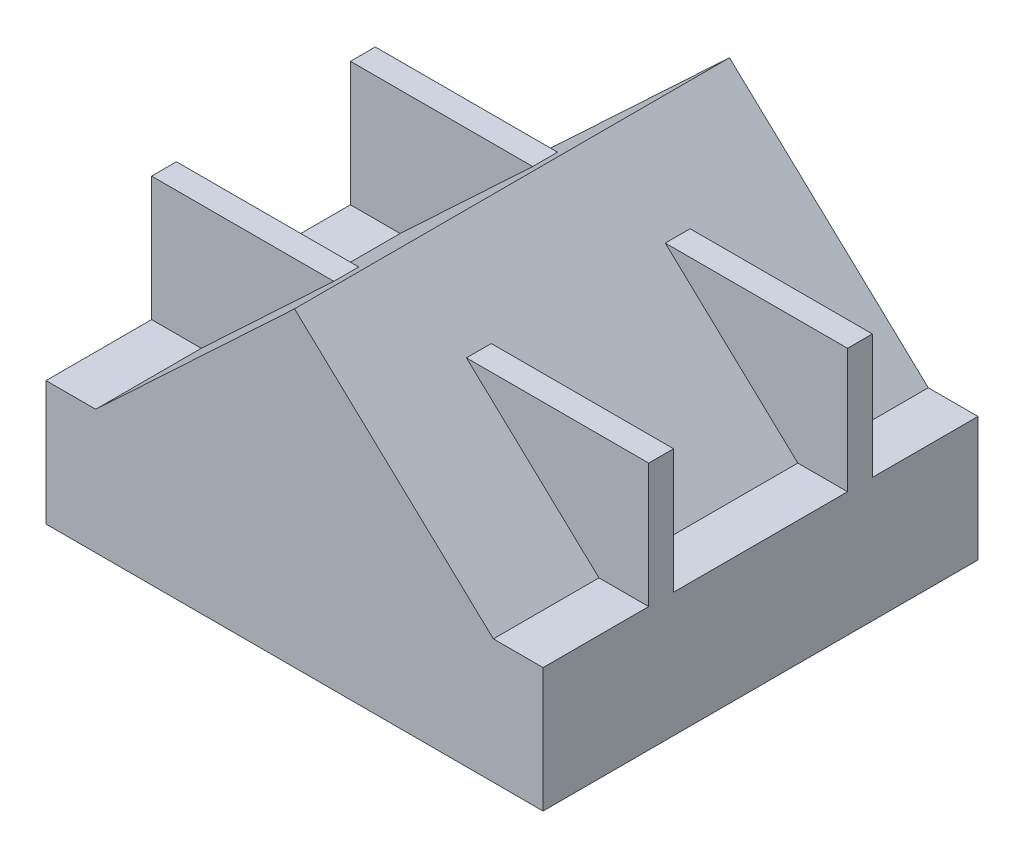
ISO-10303-21;
HEADER;
FILE_DESCRIPTION(('STEP AP214'),'2;1');
FILE_NAME('part.step','',(''),(''),'','','');
FILE_SCHEMA(('AUTOMOTIVE_DESIGN { 1 0 10303 214 1 1 1 1 }'));
ENDSEC;
DATA;
#1=APPLICATION_CONTEXT('core data for automotive mechanical design processes');
#2=APPLICATION_PROTOCOL_DEFINITION('international standard','automotive_design',2000,#1);
#3=PRODUCT_CONTEXT('',#1,'mechanical');
#4=PRODUCT('Part','Part','',(#3));
#5=PRODUCT_RELATED_PRODUCT_CATEGORY('part','',(#4));
#6=PRODUCT_DEFINITION_FORMATION('','',#4);
#7=PRODUCT_DEFINITION_CONTEXT('part definition',#1,'design');
#8=PRODUCT_DEFINITION('design','',#6,#7);
#9=PRODUCT_DEFINITION_SHAPE('','',#8);
#10=(LENGTH_UNIT() NAMED_UNIT(*) SI_UNIT(.MILLI.,.METRE.));
#11=(NAMED_UNIT(*) PLANE_ANGLE_UNIT() SI_UNIT($,.RADIAN.));
#12=(NAMED_UNIT(*) SI_UNIT($,.STERADIAN.) SOLID_ANGLE_UNIT());
#13=UNCERTAINTY_MEASURE_WITH_UNIT(LENGTH_MEASURE(1.E-05),#10,'distance_accuracy_value','');
#14=(GEOMETRIC_REPRESENTATION_CONTEXT(3) GLOBAL_UNCERTAINTY_ASSIGNED_CONTEXT((#13)) GLOBAL_UNIT_ASSIGNED_CONTEXT((#10,
#11,#12)) REPRESENTATION_CONTEXT('',''));
#15=CARTESIAN_POINT('',(0.,0.,0.));
#16=DIRECTION('',(0.,0.,1.));
#17=DIRECTION('',(1.,0.,0.));
#18=AXIS2_PLACEMENT_3D('',#15,#16,#17);
#19=CARTESIAN_POINT('',(0.,50.,0.));
#20=DIRECTION('',(0.,1.,0.));
#21=DIRECTION('',(0.,0.,1.));
#22=AXIS2_PLACEMENT_3D('',#19,#20,#21);
#23=PLANE('',#22);
#24=DIRECTION('',(0.,0.,-1.));
#25=VECTOR('',#24,1.);
#26=CARTESIAN_POINT('',(100.,50.,-102.108639935126));
#27=LINE('',#26,#25);
#28=CARTESIAN_POINT('',(100.,50.,72.8913600648739));
#29=VERTEX_POINT('',#28);
#30=CARTESIAN_POINT('',(100.,50.,30.3913600648739));
#31=VERTEX_POINT('',#30);
#32=EDGE_CURVE('E293',#29,#31,#27,.T.);
#33=ORIENTED_EDGE('',*,*,#32,.T.);
#34=DIRECTION('',(1.,0.,0.));
#35=VECTOR('',#34,1.);
#36=CARTESIAN_POINT('',(-100.,50.,30.3913600648739));
#37=LINE('',#36,#35);
#38=CARTESIAN_POINT('',(80.,50.,30.3913600648739));
#39=VERTEX_POINT('',#38);
#40=EDGE_CURVE('E370',#39,#31,#37,.T.);
#41=ORIENTED_EDGE('',*,*,#40,.F.);
#42=DIRECTION('',(0.,0.,1.));
#43=VECTOR('',#42,1.);
#44=CARTESIAN_POINT('',(80.,50.,-102.108639935126));
#45=LINE('',#44,#43);
#46=CARTESIAN_POINT('',(80.,50.,72.8913600648739));
#47=VERTEX_POINT('',#46);
#48=EDGE_CURVE('E286',#39,#47,#45,.T.);
#49=ORIENTED_EDGE('',*,*,#48,.T.);
#50=DIRECTION('',(1.,0.,0.));
#51=VECTOR('',#50,1.);
#52=CARTESIAN_POINT('',(-100.,50.,72.8913600648739));
#53=LINE('',#52,#51);
#54=EDGE_CURVE('E304',#47,#29,#53,.T.);
#55=ORIENTED_EDGE('',*,*,#54,.T.);
#56=EDGE_LOOP('',(#33,#41,#49,#55));
#57=FACE_BOUND('',#56,.T.);
#58=ADVANCED_FACE('F39',(#57),#23,.T.);
#59=CARTESIAN_POINT('',(80.,50.,-49.6086399351261));
#60=VERTEX_POINT('',#59);
#61=CARTESIAN_POINT('',(80.,50.,20.3913600648739));
#62=VERTEX_POINT('',#61);
#63=EDGE_CURVE('E285',#60,#62,#45,.T.);
#64=ORIENTED_EDGE('',*,*,#63,.T.);
#65=DIRECTION('',(-1.,0.,0.));
#66=VECTOR('',#65,1.);
#67=CARTESIAN_POINT('',(-100.,50.,20.3913600648739));
#68=LINE('',#67,#66);
#69=CARTESIAN_POINT('',(100.,50.,20.3913600648739));
#70=VERTEX_POINT('',#69);
#71=EDGE_CURVE('E213',#70,#62,#68,.T.);
#72=ORIENTED_EDGE('',*,*,#71,.F.);
#73=CARTESIAN_POINT('',(100.,50.,-49.6086399351261));
#74=VERTEX_POINT('',#73);
#75=EDGE_CURVE('E296',#70,#74,#27,.T.);
#76=ORIENTED_EDGE('',*,*,#75,.T.);
#77=DIRECTION('',(1.,0.,0.));
#78=VECTOR('',#77,1.);
#79=CARTESIAN_POINT('',(-100.,50.,-49.6086399351261));
#80=LINE('',#79,#78);
#81=EDGE_CURVE('E233',#60,#74,#80,.T.);
#82=ORIENTED_EDGE('',*,*,#81,.F.);
#83=EDGE_LOOP('',(#64,#72,#76,#82));
#84=FACE_BOUND('',#83,.T.);
#85=ADVANCED_FACE('F416',(#84),#23,.T.);
#86=DIRECTION('',(0.,0.,1.));
#87=VECTOR('',#86,1.);
#88=CARTESIAN_POINT('',(-80.,50.,-102.108639935126));
#89=LINE('',#88,#87);
#90=CARTESIAN_POINT('',(-80.,50.,30.3913600648739));
#91=VERTEX_POINT('',#90);
#92=CARTESIAN_POINT('',(-80.,50.,72.8913600648739));
#93=VERTEX_POINT('',#92);
#94=EDGE_CURVE('E291',#91,#93,#89,.T.);
#95=ORIENTED_EDGE('',*,*,#94,.F.);
#96=CARTESIAN_POINT('',(-100.,50.,30.3913600648739));
#97=VERTEX_POINT('',#96);
#98=EDGE_CURVE('E357',#97,#91,#37,.T.);
#99=ORIENTED_EDGE('',*,*,#98,.F.);
#100=DIRECTION('',(0.,0.,1.));
#101=VECTOR('',#100,1.);
#102=CARTESIAN_POINT('',(-100.,50.,-102.108639935126));
#103=LINE('',#102,#101);
#104=CARTESIAN_POINT('',(-100.,50.,72.8913600648739));
#105=VERTEX_POINT('',#104);
#106=EDGE_CURVE('E217',#97,#105,#103,.T.);
#107=ORIENTED_EDGE('',*,*,#106,.T.);
#108=EDGE_CURVE('E306',#105,#93,#53,.T.);
#109=ORIENTED_EDGE('',*,*,#108,.T.);
#110=EDGE_LOOP('',(#95,#99,#107,#109));
#111=FACE_BOUND('',#110,.T.);
#112=ADVANCED_FACE('F356',(#111),#23,.T.);
#113=CARTESIAN_POINT('',(-100.,50.,-49.6086399351261));
#114=VERTEX_POINT('',#113);
#115=CARTESIAN_POINT('',(-100.,50.,20.3913600648739));
#116=VERTEX_POINT('',#115);
#117=EDGE_CURVE('E305',#114,#116,#103,.T.);
#118=ORIENTED_EDGE('',*,*,#117,.T.);
#119=CARTESIAN_POINT('',(-80.,50.,20.3913600648739));
#120=VERTEX_POINT('',#119);
#121=EDGE_CURVE('E347',#120,#116,#68,.T.);
#122=ORIENTED_EDGE('',*,*,#121,.F.);
#123=CARTESIAN_POINT('',(-80.,50.,-49.6086399351261));
#124=VERTEX_POINT('',#123);
#125=EDGE_CURVE('E290',#124,#120,#89,.T.);
#126=ORIENTED_EDGE('',*,*,#125,.F.);
#127=EDGE_CURVE('E247',#114,#124,#80,.T.);
#128=ORIENTED_EDGE('',*,*,#127,.F.);
#129=EDGE_LOOP('',(#118,#122,#126,#128));
#130=FACE_BOUND('',#129,.T.);
#131=ADVANCED_FACE('F344',(#130),#23,.T.);
#132=CARTESIAN_POINT('',(0.,125.,-102.108639935126));
#133=DIRECTION('',(0.68394112888133,0.729537204140085,0.));
#134=DIRECTION('',(-0.729537204140085,0.68394112888133,0.));
#135=AXIS2_PLACEMENT_3D('',#132,#133,#134);
#136=PLANE('',#135);
#137=ORIENTED_EDGE('',*,*,#48,.F.);
#138=DIRECTION('',(-0.729537204140085,0.68394112888133,0.));
#139=VECTOR('',#138,1.);
#140=CARTESIAN_POINT('',(0.,125.,30.3913600648739));
#141=LINE('',#140,#139);
#142=CARTESIAN_POINT('',(26.6666666666667,100.,30.3913600648739));
#143=VERTEX_POINT('',#142);
#144=EDGE_CURVE('E59',#39,#143,#141,.T.);
#145=ORIENTED_EDGE('',*,*,#144,.T.);
#146=DIRECTION('',(0.,0.,-1.));
#147=VECTOR('',#146,1.);
#148=CARTESIAN_POINT('',(26.6666666666667,100.,-102.108639935126));
#149=LINE('',#148,#147);
#150=CARTESIAN_POINT('',(26.6666666666667,100.,20.3913600648739));
#151=VERTEX_POINT('',#150);
#152=EDGE_CURVE('E54',#143,#151,#149,.T.);
#153=ORIENTED_EDGE('',*,*,#152,.T.);
#154=DIRECTION('',(0.729537204140085,-0.68394112888133,0.));
#155=VECTOR('',#154,1.);
#156=CARTESIAN_POINT('',(0.,125.,20.3913600648739));
#157=LINE('',#156,#155);
#158=EDGE_CURVE('E222',#151,#62,#157,.T.);
#159=ORIENTED_EDGE('',*,*,#158,.T.);
#160=ORIENTED_EDGE('',*,*,#63,.F.);
#161=DIRECTION('',(-0.729537204140085,0.68394112888133,0.));
#162=VECTOR('',#161,1.);
#163=CARTESIAN_POINT('',(0.,125.,-49.6086399351261));
#164=LINE('',#163,#162);
#165=CARTESIAN_POINT('',(26.6666666666666,100.,-49.6086399351261));
#166=VERTEX_POINT('',#165);
#167=EDGE_CURVE('E266',#60,#166,#164,.T.);
#168=ORIENTED_EDGE('',*,*,#167,.T.);
#169=DIRECTION('',(0.,0.,-1.));
#170=VECTOR('',#169,1.);
#171=CARTESIAN_POINT('',(26.6666666666667,100.,-102.108639935126));
#172=LINE('',#171,#170);
#173=CARTESIAN_POINT('',(26.6666666666667,100.,-59.6086399351261));
#174=VERTEX_POINT('',#173);
#175=EDGE_CURVE('E260',#166,#174,#172,.T.);
#176=ORIENTED_EDGE('',*,*,#175,.T.);
#177=DIRECTION('',(0.729537204140085,-0.68394112888133,0.));
#178=VECTOR('',#177,1.);
#179=CARTESIAN_POINT('',(0.,125.,-59.6086399351261));
#180=LINE('',#179,#178);
#181=CARTESIAN_POINT('',(80.,50.,-59.6086399351261));
#182=VERTEX_POINT('',#181);
#183=EDGE_CURVE('E263',#174,#182,#180,.T.);
#184=ORIENTED_EDGE('',*,*,#183,.T.);
#185=CARTESIAN_POINT('',(80.,50.,-102.108639935126));
#186=VERTEX_POINT('',#185);
#187=EDGE_CURVE('E281',#186,#182,#45,.T.);
#188=ORIENTED_EDGE('',*,*,#187,.F.);
#189=DIRECTION('',(-0.729537204140085,0.68394112888133,0.));
#190=VECTOR('',#189,1.);
#191=CARTESIAN_POINT('',(0.,125.,-102.108639935126));
#192=LINE('',#191,#190);
#193=CARTESIAN_POINT('',(0.,125.,-102.108639935126));
#194=VERTEX_POINT('',#193);
#195=EDGE_CURVE('E270',#186,#194,#192,.T.);
#196=ORIENTED_EDGE('',*,*,#195,.T.);
#197=DIRECTION('',(0.,0.,1.));
#198=VECTOR('',#197,1.);
#199=CARTESIAN_POINT('',(0.,125.,-102.108639935126));
#200=LINE('',#199,#198);
#201=CARTESIAN_POINT('',(0.,125.,72.8913600648739));
#202=VERTEX_POINT('',#201);
#203=EDGE_CURVE('E276',#194,#202,#200,.T.);
#204=ORIENTED_EDGE('',*,*,#203,.T.);
#205=DIRECTION('',(-0.729537204140085,0.68394112888133,0.));
#206=VECTOR('',#205,1.);
#207=CARTESIAN_POINT('',(0.,125.,72.8913600648739));
#208=LINE('',#207,#206);
#209=EDGE_CURVE('E269',#47,#202,#208,.T.);
#210=ORIENTED_EDGE('',*,*,#209,.F.);
#211=EDGE_LOOP('',(#137,#145,#153,#159,#160,#168,#176,#184,#188,#196,#204,#210));
#212=FACE_BOUND('',#211,.T.);
#213=ADVANCED_FACE('F371',(#212),#136,.T.);
#214=CARTESIAN_POINT('',(-80.,50.,-102.108639935126));
#215=DIRECTION('',(-0.68394112888133,0.729537204140085,0.));
#216=DIRECTION('',(-0.729537204140085,-0.68394112888133,0.));
#217=AXIS2_PLACEMENT_3D('',#214,#215,#216);
#218=PLANE('',#217);
#219=DIRECTION('',(0.,0.,1.));
#220=VECTOR('',#219,1.);
#221=CARTESIAN_POINT('',(-26.6666666666667,100.,-102.108639935126));
#222=LINE('',#221,#220);
#223=CARTESIAN_POINT('',(-26.6666666666667,100.,20.3913600648739));
#224=VERTEX_POINT('',#223);
#225=CARTESIAN_POINT('',(-26.6666666666667,100.,30.3913600648739));
#226=VERTEX_POINT('',#225);
#227=EDGE_CURVE('E11',#224,#226,#222,.T.);
#228=ORIENTED_EDGE('',*,*,#227,.T.);
#229=DIRECTION('',(-0.729537204140085,-0.68394112888133,0.));
#230=VECTOR('',#229,1.);
#231=CARTESIAN_POINT('',(-80.,50.,30.3913600648739));
#232=LINE('',#231,#230);
#233=EDGE_CURVE('E199',#226,#91,#232,.T.);
#234=ORIENTED_EDGE('',*,*,#233,.T.);
#235=ORIENTED_EDGE('',*,*,#94,.T.);
#236=DIRECTION('',(-0.729537204140085,-0.68394112888133,0.));
#237=VECTOR('',#236,1.);
#238=CARTESIAN_POINT('',(-80.,50.,72.8913600648739));
#239=LINE('',#238,#237);
#240=EDGE_CURVE('E274',#202,#93,#239,.T.);
#241=ORIENTED_EDGE('',*,*,#240,.F.);
#242=ORIENTED_EDGE('',*,*,#203,.F.);
#243=DIRECTION('',(-0.729537204140085,-0.68394112888133,0.));
#244=VECTOR('',#243,1.);
#245=CARTESIAN_POINT('',(-80.,50.,-102.108639935126));
#246=LINE('',#245,#244);
#247=CARTESIAN_POINT('',(-80.,50.,-102.108639935126));
#248=VERTEX_POINT('',#247);
#249=EDGE_CURVE('E273',#194,#248,#246,.T.);
#250=ORIENTED_EDGE('',*,*,#249,.T.);
#251=CARTESIAN_POINT('',(-80.,50.,-59.6086399351261));
#252=VERTEX_POINT('',#251);
#253=EDGE_CURVE('E287',#248,#252,#89,.T.);
#254=ORIENTED_EDGE('',*,*,#253,.T.);
#255=DIRECTION('',(0.729537204140085,0.68394112888133,0.));
#256=VECTOR('',#255,1.);
#257=CARTESIAN_POINT('',(-80.,50.,-59.6086399351261));
#258=LINE('',#257,#256);
#259=CARTESIAN_POINT('',(-26.6666666666667,100.,-59.6086399351261));
#260=VERTEX_POINT('',#259);
#261=EDGE_CURVE('E332',#252,#260,#258,.T.);
#262=ORIENTED_EDGE('',*,*,#261,.T.);
#263=DIRECTION('',(0.,0.,1.));
#264=VECTOR('',#263,1.);
#265=CARTESIAN_POINT('',(-26.6666666666667,100.,-102.108639935126));
#266=LINE('',#265,#264);
#267=CARTESIAN_POINT('',(-26.6666666666667,100.,-49.6086399351261));
#268=VERTEX_POINT('',#267);
#269=EDGE_CURVE('E329',#260,#268,#266,.T.);
#270=ORIENTED_EDGE('',*,*,#269,.T.);
#271=DIRECTION('',(-0.729537204140085,-0.68394112888133,0.));
#272=VECTOR('',#271,1.);
#273=CARTESIAN_POINT('',(-80.,50.,-49.6086399351261));
#274=LINE('',#273,#272);
#275=EDGE_CURVE('E47',#268,#124,#274,.T.);
#276=ORIENTED_EDGE('',*,*,#275,.T.);
#277=ORIENTED_EDGE('',*,*,#125,.T.);
#278=DIRECTION('',(0.729537204140085,0.68394112888133,0.));
#279=VECTOR('',#278,1.);
#280=CARTESIAN_POINT('',(-80.,50.,20.3913600648739));
#281=LINE('',#280,#279);
#282=EDGE_CURVE('E219',#120,#224,#281,.T.);
#283=ORIENTED_EDGE('',*,*,#282,.T.);
#284=EDGE_LOOP('',(#228,#234,#235,#241,#242,#250,#254,#262,#270,#276,#277,#283));
#285=FACE_BOUND('',#284,.T.);
#286=ADVANCED_FACE('F339',(#285),#218,.T.);
#287=ORIENTED_EDGE('',*,*,#187,.T.);
#288=DIRECTION('',(-1.,0.,0.));
#289=VECTOR('',#288,1.);
#290=CARTESIAN_POINT('',(-100.,50.,-59.6086399351261));
#291=LINE('',#290,#289);
#292=CARTESIAN_POINT('',(100.,50.,-59.6086399351261));
#293=VERTEX_POINT('',#292);
#294=EDGE_CURVE('E238',#293,#182,#291,.T.);
#295=ORIENTED_EDGE('',*,*,#294,.F.);
#296=CARTESIAN_POINT('',(100.,50.,-102.108639935126));
#297=VERTEX_POINT('',#296);
#298=EDGE_CURVE('E297',#293,#297,#27,.T.);
#299=ORIENTED_EDGE('',*,*,#298,.T.);
#300=DIRECTION('',(-1.,0.,0.));
#301=VECTOR('',#300,1.);
#302=CARTESIAN_POINT('',(-100.,50.,-102.108639935126));
#303=LINE('',#302,#301);
#304=EDGE_CURVE('E298',#297,#186,#303,.T.);
#305=ORIENTED_EDGE('',*,*,#304,.T.);
#306=EDGE_LOOP('',(#287,#295,#299,#305));
#307=FACE_BOUND('',#306,.T.);
#308=ADVANCED_FACE('F444',(#307),#23,.T.);
#309=CARTESIAN_POINT('',(-100.,50.,-102.108639935126));
#310=VERTEX_POINT('',#309);
#311=CARTESIAN_POINT('',(-100.,50.,-59.6086399351261));
#312=VERTEX_POINT('',#311);
#313=EDGE_CURVE('E301',#310,#312,#103,.T.);
#314=ORIENTED_EDGE('',*,*,#313,.T.);
#315=EDGE_CURVE('E249',#252,#312,#291,.T.);
#316=ORIENTED_EDGE('',*,*,#315,.F.);
#317=ORIENTED_EDGE('',*,*,#253,.F.);
#318=EDGE_CURVE('E295',#248,#310,#303,.T.);
#319=ORIENTED_EDGE('',*,*,#318,.T.);
#320=EDGE_LOOP('',(#314,#316,#317,#319));
#321=FACE_BOUND('',#320,.T.);
#322=ADVANCED_FACE('F382',(#321),#23,.T.);
#323=CARTESIAN_POINT('',(100.,50.,-102.108639935126));
#324=DIRECTION('',(-1.,0.,0.));
#325=DIRECTION('',(0.,0.,1.));
#326=AXIS2_PLACEMENT_3D('',#323,#324,#325);
#327=PLANE('',#326);
#328=DIRECTION('',(0.,0.,-1.));
#329=VECTOR('',#328,1.);
#330=CARTESIAN_POINT('',(100.,0.,-102.108639935126));
#331=LINE('',#330,#329);
#332=CARTESIAN_POINT('',(100.,0.,72.8913600648739));
#333=VERTEX_POINT('',#332);
#334=CARTESIAN_POINT('',(100.,0.,-102.108639935126));
#335=VERTEX_POINT('',#334);
#336=EDGE_CURVE('E284',#333,#335,#331,.T.);
#337=ORIENTED_EDGE('',*,*,#336,.T.);
#338=DIRECTION('',(0.,-1.,0.));
#339=VECTOR('',#338,1.);
#340=CARTESIAN_POINT('',(100.,50.,-102.108639935126));
#341=LINE('',#340,#339);
#342=EDGE_CURVE('E326',#297,#335,#341,.T.);
#343=ORIENTED_EDGE('',*,*,#342,.F.);
#344=ORIENTED_EDGE('',*,*,#298,.F.);
#345=DIRECTION('',(0.,-1.,0.));
#346=VECTOR('',#345,1.);
#347=CARTESIAN_POINT('',(100.,100.,-59.6086399351261));
#348=LINE('',#347,#346);
#349=CARTESIAN_POINT('',(100.,100.,-59.6086399351261));
#350=VERTEX_POINT('',#349);
#351=EDGE_CURVE('E253',#350,#293,#348,.T.);
#352=ORIENTED_EDGE('',*,*,#351,.F.);
#353=DIRECTION('',(0.,0.,-1.));
#354=VECTOR('',#353,1.);
#355=CARTESIAN_POINT('',(100.,100.,-49.6086399351261));
#356=LINE('',#355,#354);
#357=CARTESIAN_POINT('',(100.,100.,-49.6086399351261));
#358=VERTEX_POINT('',#357);
#359=EDGE_CURVE('E241',#358,#350,#356,.T.);
#360=ORIENTED_EDGE('',*,*,#359,.F.);
#361=DIRECTION('',(0.,-1.,0.));
#362=VECTOR('',#361,1.);
#363=CARTESIAN_POINT('',(100.,100.,-49.6086399351261));
#364=LINE('',#363,#362);
#365=EDGE_CURVE('E255',#358,#74,#364,.T.);
#366=ORIENTED_EDGE('',*,*,#365,.T.);
#367=ORIENTED_EDGE('',*,*,#75,.F.);
#368=DIRECTION('',(0.,-1.,0.));
#369=VECTOR('',#368,1.);
#370=CARTESIAN_POINT('',(100.,100.,20.3913600648739));
#371=LINE('',#370,#369);
#372=CARTESIAN_POINT('',(100.,100.,20.3913600648739));
#373=VERTEX_POINT('',#372);
#374=EDGE_CURVE('E225',#373,#70,#371,.T.);
#375=ORIENTED_EDGE('',*,*,#374,.F.);
#376=DIRECTION('',(0.,0.,-1.));
#377=VECTOR('',#376,1.);
#378=CARTESIAN_POINT('',(100.,100.,30.3913600648739));
#379=LINE('',#378,#377);
#380=CARTESIAN_POINT('',(100.,100.,30.3913600648739));
#381=VERTEX_POINT('',#380);
#382=EDGE_CURVE('E202',#381,#373,#379,.T.);
#383=ORIENTED_EDGE('',*,*,#382,.F.);
#384=DIRECTION('',(0.,-1.,0.));
#385=VECTOR('',#384,1.);
#386=CARTESIAN_POINT('',(100.,100.,30.3913600648739));
#387=LINE('',#386,#385);
#388=EDGE_CURVE('E220',#381,#31,#387,.T.);
#389=ORIENTED_EDGE('',*,*,#388,.T.);
#390=ORIENTED_EDGE('',*,*,#32,.F.);
#391=DIRECTION('',(0.,-1.,0.));
#392=VECTOR('',#391,1.);
#393=CARTESIAN_POINT('',(100.,50.,72.8913600648739));
#394=LINE('',#393,#392);
#395=EDGE_CURVE('E309',#29,#333,#394,.T.);
#396=ORIENTED_EDGE('',*,*,#395,.T.);
#397=EDGE_LOOP('',(#337,#343,#344,#352,#360,#366,#367,#375,#383,#389,#390,#396));
#398=FACE_BOUND('',#397,.T.);
#399=ADVANCED_FACE('F41',(#398),#327,.F.);
#400=CARTESIAN_POINT('',(-100.,50.,-102.108639935126));
#401=DIRECTION('',(0.,0.,1.));
#402=DIRECTION('',(1.,0.,0.));
#403=AXIS2_PLACEMENT_3D('',#400,#401,#402);
#404=PLANE('',#403);
#405=DIRECTION('',(-1.,0.,0.));
#406=VECTOR('',#405,1.);
#407=CARTESIAN_POINT('',(-100.,0.,-102.108639935126));
#408=LINE('',#407,#406);
#409=CARTESIAN_POINT('',(-100.,0.,-102.108639935126));
#410=VERTEX_POINT('',#409);
#411=EDGE_CURVE('E312',#335,#410,#408,.T.);
#412=ORIENTED_EDGE('',*,*,#411,.T.);
#413=DIRECTION('',(0.,-1.,0.));
#414=VECTOR('',#413,1.);
#415=CARTESIAN_POINT('',(-100.,50.,-102.108639935126));
#416=LINE('',#415,#414);
#417=EDGE_CURVE('E323',#310,#410,#416,.T.);
#418=ORIENTED_EDGE('',*,*,#417,.F.);
#419=ORIENTED_EDGE('',*,*,#318,.F.);
#420=ORIENTED_EDGE('',*,*,#249,.F.);
#421=ORIENTED_EDGE('',*,*,#195,.F.);
#422=ORIENTED_EDGE('',*,*,#304,.F.);
#423=ORIENTED_EDGE('',*,*,#342,.T.);
#424=EDGE_LOOP('',(#412,#418,#419,#420,#421,#422,#423));
#425=FACE_BOUND('',#424,.T.);
#426=ADVANCED_FACE('F377',(#425),#404,.F.);
#427=CARTESIAN_POINT('',(-100.,50.,-102.108639935126));
#428=DIRECTION('',(1.,0.,0.));
#429=DIRECTION('',(0.,0.,-1.));
#430=AXIS2_PLACEMENT_3D('',#427,#428,#429);
#431=PLANE('',#430);
#432=DIRECTION('',(0.,0.,1.));
#433=VECTOR('',#432,1.);
#434=CARTESIAN_POINT('',(-100.,0.,-102.108639935126));
#435=LINE('',#434,#433);
#436=CARTESIAN_POINT('',(-100.,0.,72.8913600648739));
#437=VERTEX_POINT('',#436);
#438=EDGE_CURVE('E314',#410,#437,#435,.T.);
#439=ORIENTED_EDGE('',*,*,#438,.T.);
#440=DIRECTION('',(0.,-1.,0.));
#441=VECTOR('',#440,1.);
#442=CARTESIAN_POINT('',(-100.,50.,72.8913600648739));
#443=LINE('',#442,#441);
#444=EDGE_CURVE('E320',#105,#437,#443,.T.);
#445=ORIENTED_EDGE('',*,*,#444,.F.);
#446=ORIENTED_EDGE('',*,*,#106,.F.);
#447=DIRECTION('',(0.,-1.,0.));
#448=VECTOR('',#447,1.);
#449=CARTESIAN_POINT('',(-100.,100.,30.3913600648739));
#450=LINE('',#449,#448);
#451=CARTESIAN_POINT('',(-100.,100.,30.3913600648739));
#452=VERTEX_POINT('',#451);
#453=EDGE_CURVE('E198',#452,#97,#450,.T.);
#454=ORIENTED_EDGE('',*,*,#453,.F.);
#455=DIRECTION('',(0.,0.,1.));
#456=VECTOR('',#455,1.);
#457=CARTESIAN_POINT('',(-100.,100.,30.3913600648739));
#458=LINE('',#457,#456);
#459=CARTESIAN_POINT('',(-100.,100.,20.3913600648739));
#460=VERTEX_POINT('',#459);
#461=EDGE_CURVE('E206',#460,#452,#458,.T.);
#462=ORIENTED_EDGE('',*,*,#461,.F.);
#463=DIRECTION('',(0.,-1.,0.));
#464=VECTOR('',#463,1.);
#465=CARTESIAN_POINT('',(-100.,100.,20.3913600648739));
#466=LINE('',#465,#464);
#467=EDGE_CURVE('E393',#460,#116,#466,.T.);
#468=ORIENTED_EDGE('',*,*,#467,.T.);
#469=ORIENTED_EDGE('',*,*,#117,.F.);
#470=DIRECTION('',(0.,-1.,0.));
#471=VECTOR('',#470,1.);
#472=CARTESIAN_POINT('',(-100.,100.,-49.6086399351261));
#473=LINE('',#472,#471);
#474=CARTESIAN_POINT('',(-100.,100.,-49.6086399351261));
#475=VERTEX_POINT('',#474);
#476=EDGE_CURVE('E258',#475,#114,#473,.T.);
#477=ORIENTED_EDGE('',*,*,#476,.F.);
#478=DIRECTION('',(0.,0.,1.));
#479=VECTOR('',#478,1.);
#480=CARTESIAN_POINT('',(-100.,100.,-49.6086399351261));
#481=LINE('',#480,#479);
#482=CARTESIAN_POINT('',(-100.,100.,-59.6086399351261));
#483=VERTEX_POINT('',#482);
#484=EDGE_CURVE('E234',#483,#475,#481,.T.);
#485=ORIENTED_EDGE('',*,*,#484,.F.);
#486=DIRECTION('',(0.,-1.,0.));
#487=VECTOR('',#486,1.);
#488=CARTESIAN_POINT('',(-100.,100.,-59.6086399351261));
#489=LINE('',#488,#487);
#490=EDGE_CURVE('E246',#483,#312,#489,.T.);
#491=ORIENTED_EDGE('',*,*,#490,.T.);
#492=ORIENTED_EDGE('',*,*,#313,.F.);
#493=ORIENTED_EDGE('',*,*,#417,.T.);
#494=EDGE_LOOP('',(#439,#445,#446,#454,#462,#468,#469,#477,#485,#491,#492,#493));
#495=FACE_BOUND('',#494,.T.);
#496=ADVANCED_FACE('F215',(#495),#431,.F.);
#497=CARTESIAN_POINT('',(-100.,50.,72.8913600648739));
#498=DIRECTION('',(0.,0.,-1.));
#499=DIRECTION('',(-1.,0.,0.));
#500=AXIS2_PLACEMENT_3D('',#497,#498,#499);
#501=PLANE('',#500);
#502=DIRECTION('',(1.,0.,0.));
#503=VECTOR('',#502,1.);
#504=CARTESIAN_POINT('',(-100.,0.,72.8913600648739));
#505=LINE('',#504,#503);
#506=EDGE_CURVE('E316',#437,#333,#505,.T.);
#507=ORIENTED_EDGE('',*,*,#506,.T.);
#508=ORIENTED_EDGE('',*,*,#395,.F.);
#509=ORIENTED_EDGE('',*,*,#54,.F.);
#510=ORIENTED_EDGE('',*,*,#209,.T.);
#511=ORIENTED_EDGE('',*,*,#240,.T.);
#512=ORIENTED_EDGE('',*,*,#108,.F.);
#513=ORIENTED_EDGE('',*,*,#444,.T.);
#514=EDGE_LOOP('',(#507,#508,#509,#510,#511,#512,#513));
#515=FACE_BOUND('',#514,.T.);
#516=ADVANCED_FACE('F353',(#515),#501,.F.);
#517=CARTESIAN_POINT('',(0.,0.,0.));
#518=DIRECTION('',(0.,1.,0.));
#519=DIRECTION('',(0.,0.,1.));
#520=AXIS2_PLACEMENT_3D('',#517,#518,#519);
#521=PLANE('',#520);
#522=ORIENTED_EDGE('',*,*,#336,.F.);
#523=ORIENTED_EDGE('',*,*,#506,.F.);
#524=ORIENTED_EDGE('',*,*,#438,.F.);
#525=ORIENTED_EDGE('',*,*,#411,.F.);
#526=EDGE_LOOP('',(#522,#523,#524,#525));
#527=FACE_BOUND('',#526,.T.);
#528=ADVANCED_FACE('F363',(#527),#521,.F.);
#529=CARTESIAN_POINT('',(0.,100.,0.));
#530=DIRECTION('',(0.,-1.,0.));
#531=DIRECTION('',(0.,0.,-1.));
#532=AXIS2_PLACEMENT_3D('',#529,#530,#531);
#533=PLANE('',#532);
#534=ORIENTED_EDGE('',*,*,#269,.F.);
#535=DIRECTION('',(-1.,0.,0.));
#536=VECTOR('',#535,1.);
#537=CARTESIAN_POINT('',(-100.,100.,-59.6086399351261));
#538=LINE('',#537,#536);
#539=EDGE_CURVE('E243',#260,#483,#538,.T.);
#540=ORIENTED_EDGE('',*,*,#539,.T.);
#541=ORIENTED_EDGE('',*,*,#484,.T.);
#542=DIRECTION('',(1.,0.,0.));
#543=VECTOR('',#542,1.);
#544=CARTESIAN_POINT('',(-100.,100.,-49.6086399351261));
#545=LINE('',#544,#543);
#546=EDGE_CURVE('E239',#475,#268,#545,.T.);
#547=ORIENTED_EDGE('',*,*,#546,.T.);
#548=EDGE_LOOP('',(#534,#540,#541,#547));
#549=FACE_BOUND('',#548,.T.);
#550=ADVANCED_FACE('F390',(#549),#533,.F.);
#551=CARTESIAN_POINT('',(-100.,100.,-59.6086399351261));
#552=DIRECTION('',(0.,0.,1.));
#553=DIRECTION('',(1.,0.,0.));
#554=AXIS2_PLACEMENT_3D('',#551,#552,#553);
#555=PLANE('',#554);
#556=ORIENTED_EDGE('',*,*,#261,.F.);
#557=ORIENTED_EDGE('',*,*,#315,.T.);
#558=ORIENTED_EDGE('',*,*,#490,.F.);
#559=ORIENTED_EDGE('',*,*,#539,.F.);
#560=EDGE_LOOP('',(#556,#557,#558,#559));
#561=FACE_BOUND('',#560,.T.);
#562=ADVANCED_FACE('F386',(#561),#555,.F.);
#563=CARTESIAN_POINT('',(-100.,100.,-49.6086399351261));
#564=DIRECTION('',(0.,0.,-1.));
#565=DIRECTION('',(-1.,0.,0.));
#566=AXIS2_PLACEMENT_3D('',#563,#564,#565);
#567=PLANE('',#566);
#568=ORIENTED_EDGE('',*,*,#275,.F.);
#569=ORIENTED_EDGE('',*,*,#546,.F.);
#570=ORIENTED_EDGE('',*,*,#476,.T.);
#571=ORIENTED_EDGE('',*,*,#127,.T.);
#572=EDGE_LOOP('',(#568,#569,#570,#571));
#573=FACE_BOUND('',#572,.T.);
#574=ADVANCED_FACE('F392',(#573),#567,.F.);
#575=ORIENTED_EDGE('',*,*,#167,.F.);
#576=ORIENTED_EDGE('',*,*,#81,.T.);
#577=ORIENTED_EDGE('',*,*,#365,.F.);
#578=EDGE_CURVE('E237',#166,#358,#545,.T.);
#579=ORIENTED_EDGE('',*,*,#578,.F.);
#580=EDGE_LOOP('',(#575,#576,#577,#579));
#581=FACE_BOUND('',#580,.T.);
#582=ADVANCED_FACE('F554',(#581),#567,.F.);
#583=ORIENTED_EDGE('',*,*,#183,.F.);
#584=EDGE_CURVE('E244',#350,#174,#538,.T.);
#585=ORIENTED_EDGE('',*,*,#584,.F.);
#586=ORIENTED_EDGE('',*,*,#351,.T.);
#587=ORIENTED_EDGE('',*,*,#294,.T.);
#588=EDGE_LOOP('',(#583,#585,#586,#587));
#589=FACE_BOUND('',#588,.T.);
#590=ADVANCED_FACE('F546',(#589),#555,.F.);
#591=ORIENTED_EDGE('',*,*,#175,.F.);
#592=ORIENTED_EDGE('',*,*,#578,.T.);
#593=ORIENTED_EDGE('',*,*,#359,.T.);
#594=ORIENTED_EDGE('',*,*,#584,.T.);
#595=EDGE_LOOP('',(#591,#592,#593,#594));
#596=FACE_BOUND('',#595,.T.);
#597=ADVANCED_FACE('F484',(#596),#533,.F.);
#598=CARTESIAN_POINT('',(0.,100.,0.));
#599=DIRECTION('',(0.,-1.,0.));
#600=DIRECTION('',(0.,0.,-1.));
#601=AXIS2_PLACEMENT_3D('',#598,#599,#600);
#602=PLANE('',#601);
#603=ORIENTED_EDGE('',*,*,#227,.F.);
#604=DIRECTION('',(-1.,0.,0.));
#605=VECTOR('',#604,1.);
#606=CARTESIAN_POINT('',(-100.,100.,20.3913600648739));
#607=LINE('',#606,#605);
#608=EDGE_CURVE('E209',#224,#460,#607,.T.);
#609=ORIENTED_EDGE('',*,*,#608,.T.);
#610=ORIENTED_EDGE('',*,*,#461,.T.);
#611=DIRECTION('',(1.,0.,0.));
#612=VECTOR('',#611,1.);
#613=CARTESIAN_POINT('',(-100.,100.,30.3913600648739));
#614=LINE('',#613,#612);
#615=EDGE_CURVE('E193',#452,#226,#614,.T.);
#616=ORIENTED_EDGE('',*,*,#615,.T.);
#617=EDGE_LOOP('',(#603,#609,#610,#616));
#618=FACE_BOUND('',#617,.T.);
#619=ADVANCED_FACE('F207',(#618),#602,.F.);
#620=CARTESIAN_POINT('',(-100.,100.,20.3913600648739));
#621=DIRECTION('',(0.,0.,1.));
#622=DIRECTION('',(1.,0.,0.));
#623=AXIS2_PLACEMENT_3D('',#620,#621,#622);
#624=PLANE('',#623);
#625=ORIENTED_EDGE('',*,*,#282,.F.);
#626=ORIENTED_EDGE('',*,*,#121,.T.);
#627=ORIENTED_EDGE('',*,*,#467,.F.);
#628=ORIENTED_EDGE('',*,*,#608,.F.);
#629=EDGE_LOOP('',(#625,#626,#627,#628));
#630=FACE_BOUND('',#629,.T.);
#631=ADVANCED_FACE('F395',(#630),#624,.F.);
#632=CARTESIAN_POINT('',(-100.,100.,30.3913600648739));
#633=DIRECTION('',(0.,0.,-1.));
#634=DIRECTION('',(-1.,0.,0.));
#635=AXIS2_PLACEMENT_3D('',#632,#633,#634);
#636=PLANE('',#635);
#637=ORIENTED_EDGE('',*,*,#233,.F.);
#638=ORIENTED_EDGE('',*,*,#615,.F.);
#639=ORIENTED_EDGE('',*,*,#453,.T.);
#640=ORIENTED_EDGE('',*,*,#98,.T.);
#641=EDGE_LOOP('',(#637,#638,#639,#640));
#642=FACE_BOUND('',#641,.T.);
#643=ADVANCED_FACE('F195',(#642),#636,.F.);
#644=ORIENTED_EDGE('',*,*,#152,.F.);
#645=EDGE_CURVE('E203',#143,#381,#614,.T.);
#646=ORIENTED_EDGE('',*,*,#645,.T.);
#647=ORIENTED_EDGE('',*,*,#382,.T.);
#648=EDGE_CURVE('E401',#373,#151,#607,.T.);
#649=ORIENTED_EDGE('',*,*,#648,.T.);
#650=EDGE_LOOP('',(#644,#646,#647,#649));
#651=FACE_BOUND('',#650,.T.);
#652=ADVANCED_FACE('F419',(#651),#602,.F.);
#653=ORIENTED_EDGE('',*,*,#144,.F.);
#654=ORIENTED_EDGE('',*,*,#40,.T.);
#655=ORIENTED_EDGE('',*,*,#388,.F.);
#656=ORIENTED_EDGE('',*,*,#645,.F.);
#657=EDGE_LOOP('',(#653,#654,#655,#656));
#658=FACE_BOUND('',#657,.T.);
#659=ADVANCED_FACE('F424',(#658),#636,.F.);
#660=ORIENTED_EDGE('',*,*,#158,.F.);
#661=ORIENTED_EDGE('',*,*,#648,.F.);
#662=ORIENTED_EDGE('',*,*,#374,.T.);
#663=ORIENTED_EDGE('',*,*,#71,.T.);
#664=EDGE_LOOP('',(#660,#661,#662,#663));
#665=FACE_BOUND('',#664,.T.);
#666=ADVANCED_FACE('F406',(#665),#624,.F.);
#667=CLOSED_SHELL('',(#58,#85,#112,#131,#213,#286,#308,#322,#399,#426,#496,#516,#528,#550,#562,
#574,#582,#590,#597,#619,#631,#643,#652,#659,#666));
#668=MANIFOLD_SOLID_BREP('B2',#667);
#669=ADVANCED_BREP_SHAPE_REPRESENTATION('',(#18,#668),#14);
#670=SHAPE_DEFINITION_REPRESENTATION(#9,#669);
ENDSEC;
END-ISO-10303-21;
